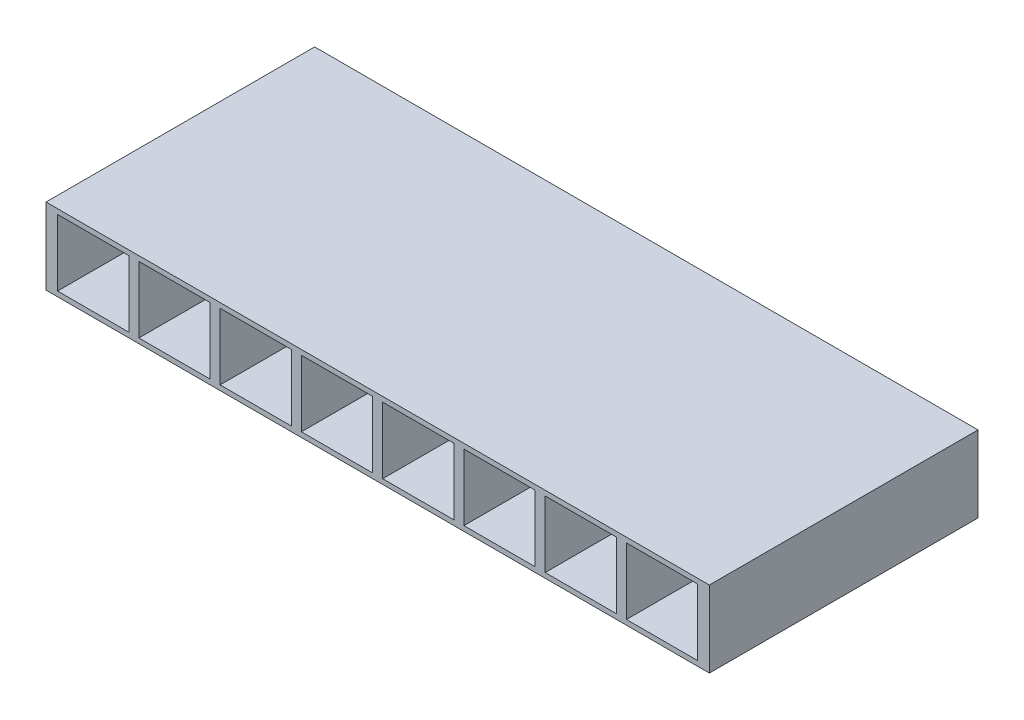
ISO-10303-21;
HEADER;
FILE_DESCRIPTION(('STEP AP214'),'2;1');
FILE_NAME('part.step','',(''),(''),'','','');
FILE_SCHEMA(('AUTOMOTIVE_DESIGN { 1 0 10303 214 1 1 1 1 }'));
ENDSEC;
DATA;
#1=APPLICATION_CONTEXT('core data for automotive mechanical design processes');
#2=APPLICATION_PROTOCOL_DEFINITION('international standard','automotive_design',2000,#1);
#3=PRODUCT_CONTEXT('',#1,'mechanical');
#4=PRODUCT('Part','Part','',(#3));
#5=PRODUCT_RELATED_PRODUCT_CATEGORY('part','',(#4));
#6=PRODUCT_DEFINITION_FORMATION('','',#4);
#7=PRODUCT_DEFINITION_CONTEXT('part definition',#1,'design');
#8=PRODUCT_DEFINITION('design','',#6,#7);
#9=PRODUCT_DEFINITION_SHAPE('','',#8);
#10=(LENGTH_UNIT() NAMED_UNIT(*) SI_UNIT(.MILLI.,.METRE.));
#11=(NAMED_UNIT(*) PLANE_ANGLE_UNIT() SI_UNIT($,.RADIAN.));
#12=(NAMED_UNIT(*) SI_UNIT($,.STERADIAN.) SOLID_ANGLE_UNIT());
#13=UNCERTAINTY_MEASURE_WITH_UNIT(LENGTH_MEASURE(1.E-05),#10,'distance_accuracy_value','');
#14=(GEOMETRIC_REPRESENTATION_CONTEXT(3) GLOBAL_UNCERTAINTY_ASSIGNED_CONTEXT((#13)) GLOBAL_UNIT_ASSIGNED_CONTEXT((#10,
#11,#12)) REPRESENTATION_CONTEXT('',''));
#15=CARTESIAN_POINT('',(0.,0.,0.));
#16=DIRECTION('',(0.,0.,1.));
#17=DIRECTION('',(1.,0.,0.));
#18=AXIS2_PLACEMENT_3D('',#15,#16,#17);
#19=CARTESIAN_POINT('',(0.,0.,8.1));
#20=DIRECTION('',(0.,0.,-1.));
#21=DIRECTION('',(-1.,0.,0.));
#22=AXIS2_PLACEMENT_3D('',#19,#20,#21);
#23=PLANE('',#22);
#24=DIRECTION('',(-1.,0.,0.));
#25=VECTOR('',#24,1.);
#26=CARTESIAN_POINT('',(7.55,1.,8.1));
#27=LINE('',#26,#25);
#28=CARTESIAN_POINT('',(9.7,1.,8.1));
#29=VERTEX_POINT('',#28);
#30=CARTESIAN_POINT('',(7.55,1.,8.1));
#31=VERTEX_POINT('',#30);
#32=EDGE_CURVE('E301',#29,#31,#27,.T.);
#33=ORIENTED_EDGE('',*,*,#32,.F.);
#34=DIRECTION('',(0.,1.,0.));
#35=VECTOR('',#34,1.);
#36=CARTESIAN_POINT('',(9.7,-1.,8.1));
#37=LINE('',#36,#35);
#38=CARTESIAN_POINT('',(9.7,-1.,8.1));
#39=VERTEX_POINT('',#38);
#40=EDGE_CURVE('E309',#39,#29,#37,.T.);
#41=ORIENTED_EDGE('',*,*,#40,.F.);
#42=DIRECTION('',(1.,0.,0.));
#43=VECTOR('',#42,1.);
#44=CARTESIAN_POINT('',(7.55,-1.,8.1));
#45=LINE('',#44,#43);
#46=CARTESIAN_POINT('',(7.55,-1.,8.1));
#47=VERTEX_POINT('',#46);
#48=EDGE_CURVE('E306',#47,#39,#45,.T.);
#49=ORIENTED_EDGE('',*,*,#48,.F.);
#50=DIRECTION('',(0.,-1.,0.));
#51=VECTOR('',#50,1.);
#52=CARTESIAN_POINT('',(7.55,-1.,8.1));
#53=LINE('',#52,#51);
#54=EDGE_CURVE('E303',#31,#47,#53,.T.);
#55=ORIENTED_EDGE('',*,*,#54,.F.);
#56=EDGE_LOOP('',(#33,#41,#49,#55));
#57=FACE_BOUND('',#56,.T.);
#58=DIRECTION('',(-1.,0.,0.));
#59=VECTOR('',#58,1.);
#60=CARTESIAN_POINT('',(2.65,1.,8.1));
#61=LINE('',#60,#59);
#62=CARTESIAN_POINT('',(4.8,1.,8.1));
#63=VERTEX_POINT('',#62);
#64=CARTESIAN_POINT('',(2.65,1.,8.1));
#65=VERTEX_POINT('',#64);
#66=EDGE_CURVE('E363',#63,#65,#61,.T.);
#67=ORIENTED_EDGE('',*,*,#66,.F.);
#68=DIRECTION('',(0.,1.,0.));
#69=VECTOR('',#68,1.);
#70=CARTESIAN_POINT('',(4.8,-1.,8.1));
#71=LINE('',#70,#69);
#72=CARTESIAN_POINT('',(4.8,-1.,8.1));
#73=VERTEX_POINT('',#72);
#74=EDGE_CURVE('E371',#73,#63,#71,.T.);
#75=ORIENTED_EDGE('',*,*,#74,.F.);
#76=DIRECTION('',(1.,0.,0.));
#77=VECTOR('',#76,1.);
#78=CARTESIAN_POINT('',(2.65,-1.,8.1));
#79=LINE('',#78,#77);
#80=CARTESIAN_POINT('',(2.65,-1.,8.1));
#81=VERTEX_POINT('',#80);
#82=EDGE_CURVE('E368',#81,#73,#79,.T.);
#83=ORIENTED_EDGE('',*,*,#82,.F.);
#84=DIRECTION('',(0.,-1.,0.));
#85=VECTOR('',#84,1.);
#86=CARTESIAN_POINT('',(2.65,-1.,8.1));
#87=LINE('',#86,#85);
#88=EDGE_CURVE('E365',#65,#81,#87,.T.);
#89=ORIENTED_EDGE('',*,*,#88,.F.);
#90=EDGE_LOOP('',(#67,#75,#83,#89));
#91=FACE_BOUND('',#90,.T.);
#92=DIRECTION('',(-1.,0.,0.));
#93=VECTOR('',#92,1.);
#94=CARTESIAN_POINT('',(-2.25,1.,8.1));
#95=LINE('',#94,#93);
#96=CARTESIAN_POINT('',(-0.1,1.,8.1));
#97=VERTEX_POINT('',#96);
#98=CARTESIAN_POINT('',(-2.25,1.,8.1));
#99=VERTEX_POINT('',#98);
#100=EDGE_CURVE('E425',#97,#99,#95,.T.);
#101=ORIENTED_EDGE('',*,*,#100,.F.);
#102=DIRECTION('',(0.,1.,0.));
#103=VECTOR('',#102,1.);
#104=CARTESIAN_POINT('',(-0.1,-1.,8.1));
#105=LINE('',#104,#103);
#106=CARTESIAN_POINT('',(-0.1,-1.,8.1));
#107=VERTEX_POINT('',#106);
#108=EDGE_CURVE('E433',#107,#97,#105,.T.);
#109=ORIENTED_EDGE('',*,*,#108,.F.);
#110=DIRECTION('',(1.,0.,0.));
#111=VECTOR('',#110,1.);
#112=CARTESIAN_POINT('',(-2.25,-1.,8.1));
#113=LINE('',#112,#111);
#114=CARTESIAN_POINT('',(-2.25,-1.,8.1));
#115=VERTEX_POINT('',#114);
#116=EDGE_CURVE('E430',#115,#107,#113,.T.);
#117=ORIENTED_EDGE('',*,*,#116,.F.);
#118=DIRECTION('',(0.,-1.,0.));
#119=VECTOR('',#118,1.);
#120=CARTESIAN_POINT('',(-2.25,-1.,8.1));
#121=LINE('',#120,#119);
#122=EDGE_CURVE('E427',#99,#115,#121,.T.);
#123=ORIENTED_EDGE('',*,*,#122,.F.);
#124=EDGE_LOOP('',(#101,#109,#117,#123));
#125=FACE_BOUND('',#124,.T.);
#126=DIRECTION('',(0.,1.,0.));
#127=VECTOR('',#126,1.);
#128=CARTESIAN_POINT('',(-5.,-1.,8.1));
#129=LINE('',#128,#127);
#130=CARTESIAN_POINT('',(-5.,-1.,8.1));
#131=VERTEX_POINT('',#130);
#132=CARTESIAN_POINT('',(-5.,1.,8.1));
#133=VERTEX_POINT('',#132);
#134=EDGE_CURVE('E487',#131,#133,#129,.T.);
#135=ORIENTED_EDGE('',*,*,#134,.F.);
#136=DIRECTION('',(1.,0.,0.));
#137=VECTOR('',#136,1.);
#138=CARTESIAN_POINT('',(-7.15,-1.,8.1));
#139=LINE('',#138,#137);
#140=CARTESIAN_POINT('',(-7.15,-1.,8.1));
#141=VERTEX_POINT('',#140);
#142=EDGE_CURVE('E495',#141,#131,#139,.T.);
#143=ORIENTED_EDGE('',*,*,#142,.F.);
#144=DIRECTION('',(0.,-1.,0.));
#145=VECTOR('',#144,1.);
#146=CARTESIAN_POINT('',(-7.15,-1.,8.1));
#147=LINE('',#146,#145);
#148=CARTESIAN_POINT('',(-7.15,1.,8.1));
#149=VERTEX_POINT('',#148);
#150=EDGE_CURVE('E492',#149,#141,#147,.T.);
#151=ORIENTED_EDGE('',*,*,#150,.F.);
#152=DIRECTION('',(-1.,0.,0.));
#153=VECTOR('',#152,1.);
#154=CARTESIAN_POINT('',(-7.15,1.,8.1));
#155=LINE('',#154,#153);
#156=EDGE_CURVE('E489',#133,#149,#155,.T.);
#157=ORIENTED_EDGE('',*,*,#156,.F.);
#158=EDGE_LOOP('',(#135,#143,#151,#157));
#159=FACE_BOUND('',#158,.T.);
#160=DIRECTION('',(0.,1.,0.));
#161=VECTOR('',#160,1.);
#162=CARTESIAN_POINT('',(12.5,-1.15,8.1));
#163=LINE('',#162,#161);
#164=CARTESIAN_POINT('',(12.5,-1.15,8.1));
#165=VERTEX_POINT('',#164);
#166=CARTESIAN_POINT('',(12.5,1.15,8.1));
#167=VERTEX_POINT('',#166);
#168=EDGE_CURVE('E518',#165,#167,#163,.T.);
#169=ORIENTED_EDGE('',*,*,#168,.T.);
#170=DIRECTION('',(-1.,0.,0.));
#171=VECTOR('',#170,1.);
#172=CARTESIAN_POINT('',(-7.5,1.15,8.1));
#173=LINE('',#172,#171);
#174=CARTESIAN_POINT('',(-7.5,1.15,8.1));
#175=VERTEX_POINT('',#174);
#176=EDGE_CURVE('E521',#167,#175,#173,.T.);
#177=ORIENTED_EDGE('',*,*,#176,.T.);
#178=DIRECTION('',(0.,-1.,0.));
#179=VECTOR('',#178,1.);
#180=CARTESIAN_POINT('',(-7.5,-1.15,8.1));
#181=LINE('',#180,#179);
#182=CARTESIAN_POINT('',(-7.5,-1.15,8.1));
#183=VERTEX_POINT('',#182);
#184=EDGE_CURVE('E524',#175,#183,#181,.T.);
#185=ORIENTED_EDGE('',*,*,#184,.T.);
#186=DIRECTION('',(1.,0.,0.));
#187=VECTOR('',#186,1.);
#188=CARTESIAN_POINT('',(-7.5,-1.15,8.1));
#189=LINE('',#188,#187);
#190=EDGE_CURVE('E526',#183,#165,#189,.T.);
#191=ORIENTED_EDGE('',*,*,#190,.T.);
#192=EDGE_LOOP('',(#169,#177,#185,#191));
#193=FACE_BOUND('',#192,.T.);
#194=DIRECTION('',(-1.,0.,0.));
#195=VECTOR('',#194,1.);
#196=CARTESIAN_POINT('',(-4.7,1.,8.1));
#197=LINE('',#196,#195);
#198=CARTESIAN_POINT('',(-2.55,1.,8.1));
#199=VERTEX_POINT('',#198);
#200=CARTESIAN_POINT('',(-4.7,1.,8.1));
#201=VERTEX_POINT('',#200);
#202=EDGE_CURVE('E456',#199,#201,#197,.T.);
#203=ORIENTED_EDGE('',*,*,#202,.F.);
#204=DIRECTION('',(0.,1.,0.));
#205=VECTOR('',#204,1.);
#206=CARTESIAN_POINT('',(-2.55,-1.,8.1));
#207=LINE('',#206,#205);
#208=CARTESIAN_POINT('',(-2.55,-1.,8.1));
#209=VERTEX_POINT('',#208);
#210=EDGE_CURVE('E464',#209,#199,#207,.T.);
#211=ORIENTED_EDGE('',*,*,#210,.F.);
#212=DIRECTION('',(1.,0.,0.));
#213=VECTOR('',#212,1.);
#214=CARTESIAN_POINT('',(-4.7,-1.,8.1));
#215=LINE('',#214,#213);
#216=CARTESIAN_POINT('',(-4.7,-1.,8.1));
#217=VERTEX_POINT('',#216);
#218=EDGE_CURVE('E461',#217,#209,#215,.T.);
#219=ORIENTED_EDGE('',*,*,#218,.F.);
#220=DIRECTION('',(0.,-1.,0.));
#221=VECTOR('',#220,1.);
#222=CARTESIAN_POINT('',(-4.7,-1.,8.1));
#223=LINE('',#222,#221);
#224=EDGE_CURVE('E458',#201,#217,#223,.T.);
#225=ORIENTED_EDGE('',*,*,#224,.F.);
#226=EDGE_LOOP('',(#203,#211,#219,#225));
#227=FACE_BOUND('',#226,.T.);
#228=DIRECTION('',(-1.,0.,0.));
#229=VECTOR('',#228,1.);
#230=CARTESIAN_POINT('',(0.2,1.,8.1));
#231=LINE('',#230,#229);
#232=CARTESIAN_POINT('',(2.35,1.,8.1));
#233=VERTEX_POINT('',#232);
#234=CARTESIAN_POINT('',(0.2,1.,8.1));
#235=VERTEX_POINT('',#234);
#236=EDGE_CURVE('E394',#233,#235,#231,.T.);
#237=ORIENTED_EDGE('',*,*,#236,.F.);
#238=DIRECTION('',(0.,1.,0.));
#239=VECTOR('',#238,1.);
#240=CARTESIAN_POINT('',(2.35,-1.,8.1));
#241=LINE('',#240,#239);
#242=CARTESIAN_POINT('',(2.35,-1.,8.1));
#243=VERTEX_POINT('',#242);
#244=EDGE_CURVE('E402',#243,#233,#241,.T.);
#245=ORIENTED_EDGE('',*,*,#244,.F.);
#246=DIRECTION('',(1.,0.,0.));
#247=VECTOR('',#246,1.);
#248=CARTESIAN_POINT('',(0.2,-1.,8.1));
#249=LINE('',#248,#247);
#250=CARTESIAN_POINT('',(0.2,-1.,8.1));
#251=VERTEX_POINT('',#250);
#252=EDGE_CURVE('E399',#251,#243,#249,.T.);
#253=ORIENTED_EDGE('',*,*,#252,.F.);
#254=DIRECTION('',(0.,-1.,0.));
#255=VECTOR('',#254,1.);
#256=CARTESIAN_POINT('',(0.2,-1.,8.1));
#257=LINE('',#256,#255);
#258=EDGE_CURVE('E396',#235,#251,#257,.T.);
#259=ORIENTED_EDGE('',*,*,#258,.F.);
#260=EDGE_LOOP('',(#237,#245,#253,#259));
#261=FACE_BOUND('',#260,.T.);
#262=DIRECTION('',(-1.,0.,0.));
#263=VECTOR('',#262,1.);
#264=CARTESIAN_POINT('',(5.1,1.,8.1));
#265=LINE('',#264,#263);
#266=CARTESIAN_POINT('',(7.25,1.,8.1));
#267=VERTEX_POINT('',#266);
#268=CARTESIAN_POINT('',(5.1,1.,8.1));
#269=VERTEX_POINT('',#268);
#270=EDGE_CURVE('E332',#267,#269,#265,.T.);
#271=ORIENTED_EDGE('',*,*,#270,.F.);
#272=DIRECTION('',(0.,1.,0.));
#273=VECTOR('',#272,1.);
#274=CARTESIAN_POINT('',(7.25,-1.,8.1));
#275=LINE('',#274,#273);
#276=CARTESIAN_POINT('',(7.25,-1.,8.1));
#277=VERTEX_POINT('',#276);
#278=EDGE_CURVE('E340',#277,#267,#275,.T.);
#279=ORIENTED_EDGE('',*,*,#278,.F.);
#280=DIRECTION('',(1.,0.,0.));
#281=VECTOR('',#280,1.);
#282=CARTESIAN_POINT('',(5.1,-1.,8.1));
#283=LINE('',#282,#281);
#284=CARTESIAN_POINT('',(5.1,-1.,8.1));
#285=VERTEX_POINT('',#284);
#286=EDGE_CURVE('E337',#285,#277,#283,.T.);
#287=ORIENTED_EDGE('',*,*,#286,.F.);
#288=DIRECTION('',(0.,-1.,0.));
#289=VECTOR('',#288,1.);
#290=CARTESIAN_POINT('',(5.1,-1.,8.1));
#291=LINE('',#290,#289);
#292=EDGE_CURVE('E334',#269,#285,#291,.T.);
#293=ORIENTED_EDGE('',*,*,#292,.F.);
#294=EDGE_LOOP('',(#271,#279,#287,#293));
#295=FACE_BOUND('',#294,.T.);
#296=DIRECTION('',(-1.,0.,0.));
#297=VECTOR('',#296,1.);
#298=CARTESIAN_POINT('',(10.,1.,8.1));
#299=LINE('',#298,#297);
#300=CARTESIAN_POINT('',(12.15,1.,8.1));
#301=VERTEX_POINT('',#300);
#302=CARTESIAN_POINT('',(10.,1.,8.1));
#303=VERTEX_POINT('',#302);
#304=EDGE_CURVE('E265',#301,#303,#299,.T.);
#305=ORIENTED_EDGE('',*,*,#304,.F.);
#306=DIRECTION('',(0.,1.,0.));
#307=VECTOR('',#306,1.);
#308=CARTESIAN_POINT('',(12.15,-1.,8.1));
#309=LINE('',#308,#307);
#310=CARTESIAN_POINT('',(12.15,-1.,8.1));
#311=VERTEX_POINT('',#310);
#312=EDGE_CURVE('E287',#311,#301,#309,.T.);
#313=ORIENTED_EDGE('',*,*,#312,.F.);
#314=DIRECTION('',(1.,0.,0.));
#315=VECTOR('',#314,1.);
#316=CARTESIAN_POINT('',(10.,-1.,8.1));
#317=LINE('',#316,#315);
#318=CARTESIAN_POINT('',(10.,-1.,8.1));
#319=VERTEX_POINT('',#318);
#320=EDGE_CURVE('E285',#319,#311,#317,.T.);
#321=ORIENTED_EDGE('',*,*,#320,.F.);
#322=DIRECTION('',(0.,-1.,0.));
#323=VECTOR('',#322,1.);
#324=CARTESIAN_POINT('',(10.,-1.,8.1));
#325=LINE('',#324,#323);
#326=EDGE_CURVE('E273',#303,#319,#325,.T.);
#327=ORIENTED_EDGE('',*,*,#326,.F.);
#328=EDGE_LOOP('',(#305,#313,#321,#327));
#329=FACE_BOUND('',#328,.T.);
#330=ADVANCED_FACE('F32',(#57,#91,#125,#159,#193,#227,#261,#295,#329),#23,.F.);
#331=CARTESIAN_POINT('',(0.,0.,0.));
#332=DIRECTION('',(0.,0.,-1.));
#333=DIRECTION('',(-1.,0.,0.));
#334=AXIS2_PLACEMENT_3D('',#331,#332,#333);
#335=PLANE('',#334);
#336=DIRECTION('',(0.,1.,0.));
#337=VECTOR('',#336,1.);
#338=CARTESIAN_POINT('',(12.5,-1.15,0.));
#339=LINE('',#338,#337);
#340=CARTESIAN_POINT('',(12.5,-1.15,0.));
#341=VERTEX_POINT('',#340);
#342=CARTESIAN_POINT('',(12.5,1.15,0.));
#343=VERTEX_POINT('',#342);
#344=EDGE_CURVE('E517',#341,#343,#339,.T.);
#345=ORIENTED_EDGE('',*,*,#344,.F.);
#346=DIRECTION('',(1.,0.,0.));
#347=VECTOR('',#346,1.);
#348=CARTESIAN_POINT('',(-7.5,-1.15,0.));
#349=LINE('',#348,#347);
#350=CARTESIAN_POINT('',(-7.5,-1.15,0.));
#351=VERTEX_POINT('',#350);
#352=EDGE_CURVE('E522',#351,#341,#349,.T.);
#353=ORIENTED_EDGE('',*,*,#352,.F.);
#354=DIRECTION('',(0.,-1.,0.));
#355=VECTOR('',#354,1.);
#356=CARTESIAN_POINT('',(-7.5,-1.15,0.));
#357=LINE('',#356,#355);
#358=CARTESIAN_POINT('',(-7.5,1.15,0.));
#359=VERTEX_POINT('',#358);
#360=EDGE_CURVE('E533',#359,#351,#357,.T.);
#361=ORIENTED_EDGE('',*,*,#360,.F.);
#362=DIRECTION('',(-1.,0.,0.));
#363=VECTOR('',#362,1.);
#364=CARTESIAN_POINT('',(-7.5,1.15,0.));
#365=LINE('',#364,#363);
#366=EDGE_CURVE('E531',#343,#359,#365,.T.);
#367=ORIENTED_EDGE('',*,*,#366,.F.);
#368=EDGE_LOOP('',(#345,#353,#361,#367));
#369=FACE_BOUND('',#368,.T.);
#370=DIRECTION('',(1.,0.,0.));
#371=VECTOR('',#370,1.);
#372=CARTESIAN_POINT('',(-7.15,-1.,0.));
#373=LINE('',#372,#371);
#374=CARTESIAN_POINT('',(-7.15,-1.,0.));
#375=VERTEX_POINT('',#374);
#376=CARTESIAN_POINT('',(-5.,-1.,0.));
#377=VERTEX_POINT('',#376);
#378=EDGE_CURVE('E490',#375,#377,#373,.T.);
#379=ORIENTED_EDGE('',*,*,#378,.T.);
#380=DIRECTION('',(0.,1.,0.));
#381=VECTOR('',#380,1.);
#382=CARTESIAN_POINT('',(-5.,-1.,0.));
#383=LINE('',#382,#381);
#384=CARTESIAN_POINT('',(-5.,1.,0.));
#385=VERTEX_POINT('',#384);
#386=EDGE_CURVE('E486',#377,#385,#383,.T.);
#387=ORIENTED_EDGE('',*,*,#386,.T.);
#388=DIRECTION('',(-1.,0.,0.));
#389=VECTOR('',#388,1.);
#390=CARTESIAN_POINT('',(-7.15,1.,0.));
#391=LINE('',#390,#389);
#392=CARTESIAN_POINT('',(-7.15,1.,0.));
#393=VERTEX_POINT('',#392);
#394=EDGE_CURVE('E500',#385,#393,#391,.T.);
#395=ORIENTED_EDGE('',*,*,#394,.T.);
#396=DIRECTION('',(0.,-1.,0.));
#397=VECTOR('',#396,1.);
#398=CARTESIAN_POINT('',(-7.15,-1.,0.));
#399=LINE('',#398,#397);
#400=EDGE_CURVE('E503',#393,#375,#399,.T.);
#401=ORIENTED_EDGE('',*,*,#400,.T.);
#402=EDGE_LOOP('',(#379,#387,#395,#401));
#403=FACE_BOUND('',#402,.T.);
#404=DIRECTION('',(0.,1.,0.));
#405=VECTOR('',#404,1.);
#406=CARTESIAN_POINT('',(-2.55,-1.,0.));
#407=LINE('',#406,#405);
#408=CARTESIAN_POINT('',(-2.55,-1.,0.));
#409=VERTEX_POINT('',#408);
#410=CARTESIAN_POINT('',(-2.55,1.,0.));
#411=VERTEX_POINT('',#410);
#412=EDGE_CURVE('E459',#409,#411,#407,.T.);
#413=ORIENTED_EDGE('',*,*,#412,.T.);
#414=DIRECTION('',(-1.,0.,0.));
#415=VECTOR('',#414,1.);
#416=CARTESIAN_POINT('',(-4.7,1.,0.));
#417=LINE('',#416,#415);
#418=CARTESIAN_POINT('',(-4.7,1.,0.));
#419=VERTEX_POINT('',#418);
#420=EDGE_CURVE('E455',#411,#419,#417,.T.);
#421=ORIENTED_EDGE('',*,*,#420,.T.);
#422=DIRECTION('',(0.,-1.,0.));
#423=VECTOR('',#422,1.);
#424=CARTESIAN_POINT('',(-4.7,-1.,0.));
#425=LINE('',#424,#423);
#426=CARTESIAN_POINT('',(-4.7,-1.,0.));
#427=VERTEX_POINT('',#426);
#428=EDGE_CURVE('E469',#419,#427,#425,.T.);
#429=ORIENTED_EDGE('',*,*,#428,.T.);
#430=DIRECTION('',(1.,0.,0.));
#431=VECTOR('',#430,1.);
#432=CARTESIAN_POINT('',(-4.7,-1.,0.));
#433=LINE('',#432,#431);
#434=EDGE_CURVE('E472',#427,#409,#433,.T.);
#435=ORIENTED_EDGE('',*,*,#434,.T.);
#436=EDGE_LOOP('',(#413,#421,#429,#435));
#437=FACE_BOUND('',#436,.T.);
#438=DIRECTION('',(0.,1.,0.));
#439=VECTOR('',#438,1.);
#440=CARTESIAN_POINT('',(-0.1,-1.,0.));
#441=LINE('',#440,#439);
#442=CARTESIAN_POINT('',(-0.1,-1.,0.));
#443=VERTEX_POINT('',#442);
#444=CARTESIAN_POINT('',(-0.1,1.,0.));
#445=VERTEX_POINT('',#444);
#446=EDGE_CURVE('E428',#443,#445,#441,.T.);
#447=ORIENTED_EDGE('',*,*,#446,.T.);
#448=DIRECTION('',(-1.,0.,0.));
#449=VECTOR('',#448,1.);
#450=CARTESIAN_POINT('',(-2.25,1.,0.));
#451=LINE('',#450,#449);
#452=CARTESIAN_POINT('',(-2.25,1.,0.));
#453=VERTEX_POINT('',#452);
#454=EDGE_CURVE('E424',#445,#453,#451,.T.);
#455=ORIENTED_EDGE('',*,*,#454,.T.);
#456=DIRECTION('',(0.,-1.,0.));
#457=VECTOR('',#456,1.);
#458=CARTESIAN_POINT('',(-2.25,-1.,0.));
#459=LINE('',#458,#457);
#460=CARTESIAN_POINT('',(-2.25,-1.,0.));
#461=VERTEX_POINT('',#460);
#462=EDGE_CURVE('E438',#453,#461,#459,.T.);
#463=ORIENTED_EDGE('',*,*,#462,.T.);
#464=DIRECTION('',(1.,0.,0.));
#465=VECTOR('',#464,1.);
#466=CARTESIAN_POINT('',(-2.25,-1.,0.));
#467=LINE('',#466,#465);
#468=EDGE_CURVE('E441',#461,#443,#467,.T.);
#469=ORIENTED_EDGE('',*,*,#468,.T.);
#470=EDGE_LOOP('',(#447,#455,#463,#469));
#471=FACE_BOUND('',#470,.T.);
#472=DIRECTION('',(0.,1.,0.));
#473=VECTOR('',#472,1.);
#474=CARTESIAN_POINT('',(2.35,-1.,0.));
#475=LINE('',#474,#473);
#476=CARTESIAN_POINT('',(2.35,-1.,0.));
#477=VERTEX_POINT('',#476);
#478=CARTESIAN_POINT('',(2.35,1.,0.));
#479=VERTEX_POINT('',#478);
#480=EDGE_CURVE('E397',#477,#479,#475,.T.);
#481=ORIENTED_EDGE('',*,*,#480,.T.);
#482=DIRECTION('',(-1.,0.,0.));
#483=VECTOR('',#482,1.);
#484=CARTESIAN_POINT('',(0.2,1.,0.));
#485=LINE('',#484,#483);
#486=CARTESIAN_POINT('',(0.2,1.,0.));
#487=VERTEX_POINT('',#486);
#488=EDGE_CURVE('E393',#479,#487,#485,.T.);
#489=ORIENTED_EDGE('',*,*,#488,.T.);
#490=DIRECTION('',(0.,-1.,0.));
#491=VECTOR('',#490,1.);
#492=CARTESIAN_POINT('',(0.2,-1.,0.));
#493=LINE('',#492,#491);
#494=CARTESIAN_POINT('',(0.2,-1.,0.));
#495=VERTEX_POINT('',#494);
#496=EDGE_CURVE('E407',#487,#495,#493,.T.);
#497=ORIENTED_EDGE('',*,*,#496,.T.);
#498=DIRECTION('',(1.,0.,0.));
#499=VECTOR('',#498,1.);
#500=CARTESIAN_POINT('',(0.2,-1.,0.));
#501=LINE('',#500,#499);
#502=EDGE_CURVE('E410',#495,#477,#501,.T.);
#503=ORIENTED_EDGE('',*,*,#502,.T.);
#504=EDGE_LOOP('',(#481,#489,#497,#503));
#505=FACE_BOUND('',#504,.T.);
#506=DIRECTION('',(0.,1.,0.));
#507=VECTOR('',#506,1.);
#508=CARTESIAN_POINT('',(4.8,-1.,0.));
#509=LINE('',#508,#507);
#510=CARTESIAN_POINT('',(4.8,-1.,0.));
#511=VERTEX_POINT('',#510);
#512=CARTESIAN_POINT('',(4.8,1.,0.));
#513=VERTEX_POINT('',#512);
#514=EDGE_CURVE('E366',#511,#513,#509,.T.);
#515=ORIENTED_EDGE('',*,*,#514,.T.);
#516=DIRECTION('',(-1.,0.,0.));
#517=VECTOR('',#516,1.);
#518=CARTESIAN_POINT('',(2.65,1.,0.));
#519=LINE('',#518,#517);
#520=CARTESIAN_POINT('',(2.65,1.,0.));
#521=VERTEX_POINT('',#520);
#522=EDGE_CURVE('E362',#513,#521,#519,.T.);
#523=ORIENTED_EDGE('',*,*,#522,.T.);
#524=DIRECTION('',(0.,-1.,0.));
#525=VECTOR('',#524,1.);
#526=CARTESIAN_POINT('',(2.65,-1.,0.));
#527=LINE('',#526,#525);
#528=CARTESIAN_POINT('',(2.65,-1.,0.));
#529=VERTEX_POINT('',#528);
#530=EDGE_CURVE('E376',#521,#529,#527,.T.);
#531=ORIENTED_EDGE('',*,*,#530,.T.);
#532=DIRECTION('',(1.,0.,0.));
#533=VECTOR('',#532,1.);
#534=CARTESIAN_POINT('',(2.65,-1.,0.));
#535=LINE('',#534,#533);
#536=EDGE_CURVE('E379',#529,#511,#535,.T.);
#537=ORIENTED_EDGE('',*,*,#536,.T.);
#538=EDGE_LOOP('',(#515,#523,#531,#537));
#539=FACE_BOUND('',#538,.T.);
#540=DIRECTION('',(0.,1.,0.));
#541=VECTOR('',#540,1.);
#542=CARTESIAN_POINT('',(7.25,-1.,0.));
#543=LINE('',#542,#541);
#544=CARTESIAN_POINT('',(7.25,-1.,0.));
#545=VERTEX_POINT('',#544);
#546=CARTESIAN_POINT('',(7.25,1.,0.));
#547=VERTEX_POINT('',#546);
#548=EDGE_CURVE('E335',#545,#547,#543,.T.);
#549=ORIENTED_EDGE('',*,*,#548,.T.);
#550=DIRECTION('',(-1.,0.,0.));
#551=VECTOR('',#550,1.);
#552=CARTESIAN_POINT('',(5.1,1.,0.));
#553=LINE('',#552,#551);
#554=CARTESIAN_POINT('',(5.1,1.,0.));
#555=VERTEX_POINT('',#554);
#556=EDGE_CURVE('E331',#547,#555,#553,.T.);
#557=ORIENTED_EDGE('',*,*,#556,.T.);
#558=DIRECTION('',(0.,-1.,0.));
#559=VECTOR('',#558,1.);
#560=CARTESIAN_POINT('',(5.1,-1.,0.));
#561=LINE('',#560,#559);
#562=CARTESIAN_POINT('',(5.1,-1.,0.));
#563=VERTEX_POINT('',#562);
#564=EDGE_CURVE('E345',#555,#563,#561,.T.);
#565=ORIENTED_EDGE('',*,*,#564,.T.);
#566=DIRECTION('',(1.,0.,0.));
#567=VECTOR('',#566,1.);
#568=CARTESIAN_POINT('',(5.1,-1.,0.));
#569=LINE('',#568,#567);
#570=EDGE_CURVE('E348',#563,#545,#569,.T.);
#571=ORIENTED_EDGE('',*,*,#570,.T.);
#572=EDGE_LOOP('',(#549,#557,#565,#571));
#573=FACE_BOUND('',#572,.T.);
#574=DIRECTION('',(0.,1.,0.));
#575=VECTOR('',#574,1.);
#576=CARTESIAN_POINT('',(9.7,-1.,0.));
#577=LINE('',#576,#575);
#578=CARTESIAN_POINT('',(9.7,-1.,0.));
#579=VERTEX_POINT('',#578);
#580=CARTESIAN_POINT('',(9.7,1.,0.));
#581=VERTEX_POINT('',#580);
#582=EDGE_CURVE('E304',#579,#581,#577,.T.);
#583=ORIENTED_EDGE('',*,*,#582,.T.);
#584=DIRECTION('',(-1.,0.,0.));
#585=VECTOR('',#584,1.);
#586=CARTESIAN_POINT('',(7.55,1.,0.));
#587=LINE('',#586,#585);
#588=CARTESIAN_POINT('',(7.55,1.,0.));
#589=VERTEX_POINT('',#588);
#590=EDGE_CURVE('E281',#581,#589,#587,.T.);
#591=ORIENTED_EDGE('',*,*,#590,.T.);
#592=DIRECTION('',(0.,-1.,0.));
#593=VECTOR('',#592,1.);
#594=CARTESIAN_POINT('',(7.55,-1.,0.));
#595=LINE('',#594,#593);
#596=CARTESIAN_POINT('',(7.55,-1.,0.));
#597=VERTEX_POINT('',#596);
#598=EDGE_CURVE('E314',#589,#597,#595,.T.);
#599=ORIENTED_EDGE('',*,*,#598,.T.);
#600=DIRECTION('',(1.,0.,0.));
#601=VECTOR('',#600,1.);
#602=CARTESIAN_POINT('',(7.55,-1.,0.));
#603=LINE('',#602,#601);
#604=EDGE_CURVE('E317',#597,#579,#603,.T.);
#605=ORIENTED_EDGE('',*,*,#604,.T.);
#606=EDGE_LOOP('',(#583,#591,#599,#605));
#607=FACE_BOUND('',#606,.T.);
#608=DIRECTION('',(0.,1.,0.));
#609=VECTOR('',#608,1.);
#610=CARTESIAN_POINT('',(12.15,-1.,0.));
#611=LINE('',#610,#609);
#612=CARTESIAN_POINT('',(12.15,-1.,0.));
#613=VERTEX_POINT('',#612);
#614=CARTESIAN_POINT('',(12.15,1.,0.));
#615=VERTEX_POINT('',#614);
#616=EDGE_CURVE('E274',#613,#615,#611,.T.);
#617=ORIENTED_EDGE('',*,*,#616,.T.);
#618=DIRECTION('',(-1.,0.,0.));
#619=VECTOR('',#618,1.);
#620=CARTESIAN_POINT('',(10.,1.,0.));
#621=LINE('',#620,#619);
#622=CARTESIAN_POINT('',(10.,1.,0.));
#623=VERTEX_POINT('',#622);
#624=EDGE_CURVE('E55',#615,#623,#621,.T.);
#625=ORIENTED_EDGE('',*,*,#624,.T.);
#626=DIRECTION('',(0.,-1.,0.));
#627=VECTOR('',#626,1.);
#628=CARTESIAN_POINT('',(10.,-1.,0.));
#629=LINE('',#628,#627);
#630=CARTESIAN_POINT('',(10.,-1.,0.));
#631=VERTEX_POINT('',#630);
#632=EDGE_CURVE('E280',#623,#631,#629,.T.);
#633=ORIENTED_EDGE('',*,*,#632,.T.);
#634=DIRECTION('',(1.,0.,0.));
#635=VECTOR('',#634,1.);
#636=CARTESIAN_POINT('',(10.,-1.,0.));
#637=LINE('',#636,#635);
#638=EDGE_CURVE('E293',#631,#613,#637,.T.);
#639=ORIENTED_EDGE('',*,*,#638,.T.);
#640=EDGE_LOOP('',(#617,#625,#633,#639));
#641=FACE_BOUND('',#640,.T.);
#642=ADVANCED_FACE('F551',(#369,#403,#437,#471,#505,#539,#573,#607,#641),#335,.T.);
#643=CARTESIAN_POINT('',(12.5,-1.15,8.1));
#644=DIRECTION('',(-1.,0.,0.));
#645=DIRECTION('',(0.,0.,1.));
#646=AXIS2_PLACEMENT_3D('',#643,#644,#645);
#647=PLANE('',#646);
#648=ORIENTED_EDGE('',*,*,#344,.T.);
#649=DIRECTION('',(0.,0.,-1.));
#650=VECTOR('',#649,1.);
#651=CARTESIAN_POINT('',(12.5,1.15,8.1));
#652=LINE('',#651,#650);
#653=EDGE_CURVE('E11',#167,#343,#652,.T.);
#654=ORIENTED_EDGE('',*,*,#653,.F.);
#655=ORIENTED_EDGE('',*,*,#168,.F.);
#656=DIRECTION('',(0.,0.,-1.));
#657=VECTOR('',#656,1.);
#658=CARTESIAN_POINT('',(12.5,-1.15,8.1));
#659=LINE('',#658,#657);
#660=EDGE_CURVE('E528',#165,#341,#659,.T.);
#661=ORIENTED_EDGE('',*,*,#660,.T.);
#662=EDGE_LOOP('',(#648,#654,#655,#661));
#663=FACE_BOUND('',#662,.T.);
#664=ADVANCED_FACE('F34',(#663),#647,.F.);
#665=CARTESIAN_POINT('',(-7.5,1.15,8.1));
#666=DIRECTION('',(0.,-1.,0.));
#667=DIRECTION('',(1.,0.,0.));
#668=AXIS2_PLACEMENT_3D('',#665,#666,#667);
#669=PLANE('',#668);
#670=ORIENTED_EDGE('',*,*,#366,.T.);
#671=DIRECTION('',(0.,0.,-1.));
#672=VECTOR('',#671,1.);
#673=CARTESIAN_POINT('',(-7.5,1.15,8.1));
#674=LINE('',#673,#672);
#675=EDGE_CURVE('E40',#175,#359,#674,.T.);
#676=ORIENTED_EDGE('',*,*,#675,.F.);
#677=ORIENTED_EDGE('',*,*,#176,.F.);
#678=ORIENTED_EDGE('',*,*,#653,.T.);
#679=EDGE_LOOP('',(#670,#676,#677,#678));
#680=FACE_BOUND('',#679,.T.);
#681=ADVANCED_FACE('F562',(#680),#669,.F.);
#682=CARTESIAN_POINT('',(-7.5,-1.15,8.1));
#683=DIRECTION('',(1.,0.,0.));
#684=DIRECTION('',(0.,0.,-1.));
#685=AXIS2_PLACEMENT_3D('',#682,#683,#684);
#686=PLANE('',#685);
#687=ORIENTED_EDGE('',*,*,#360,.T.);
#688=DIRECTION('',(0.,0.,-1.));
#689=VECTOR('',#688,1.);
#690=CARTESIAN_POINT('',(-7.5,-1.15,8.1));
#691=LINE('',#690,#689);
#692=EDGE_CURVE('E538',#183,#351,#691,.T.);
#693=ORIENTED_EDGE('',*,*,#692,.F.);
#694=ORIENTED_EDGE('',*,*,#184,.F.);
#695=ORIENTED_EDGE('',*,*,#675,.T.);
#696=EDGE_LOOP('',(#687,#693,#694,#695));
#697=FACE_BOUND('',#696,.T.);
#698=ADVANCED_FACE('F545',(#697),#686,.F.);
#699=CARTESIAN_POINT('',(-7.5,-1.15,8.1));
#700=DIRECTION('',(0.,1.,0.));
#701=DIRECTION('',(-1.,0.,0.));
#702=AXIS2_PLACEMENT_3D('',#699,#700,#701);
#703=PLANE('',#702);
#704=ORIENTED_EDGE('',*,*,#352,.T.);
#705=ORIENTED_EDGE('',*,*,#660,.F.);
#706=ORIENTED_EDGE('',*,*,#190,.F.);
#707=ORIENTED_EDGE('',*,*,#692,.T.);
#708=EDGE_LOOP('',(#704,#705,#706,#707));
#709=FACE_BOUND('',#708,.T.);
#710=ADVANCED_FACE('F555',(#709),#703,.F.);
#711=CARTESIAN_POINT('',(-5.,-1.,8.1));
#712=DIRECTION('',(-1.,0.,0.));
#713=DIRECTION('',(0.,0.,1.));
#714=AXIS2_PLACEMENT_3D('',#711,#712,#713);
#715=PLANE('',#714);
#716=ORIENTED_EDGE('',*,*,#386,.F.);
#717=DIRECTION('',(0.,0.,-1.));
#718=VECTOR('',#717,1.);
#719=CARTESIAN_POINT('',(-5.,-1.,8.1));
#720=LINE('',#719,#718);
#721=EDGE_CURVE('E497',#131,#377,#720,.T.);
#722=ORIENTED_EDGE('',*,*,#721,.F.);
#723=ORIENTED_EDGE('',*,*,#134,.T.);
#724=DIRECTION('',(0.,0.,-1.));
#725=VECTOR('',#724,1.);
#726=CARTESIAN_POINT('',(-5.,1.,8.1));
#727=LINE('',#726,#725);
#728=EDGE_CURVE('E514',#133,#385,#727,.T.);
#729=ORIENTED_EDGE('',*,*,#728,.T.);
#730=EDGE_LOOP('',(#716,#722,#723,#729));
#731=FACE_BOUND('',#730,.T.);
#732=ADVANCED_FACE('F579',(#731),#715,.T.);
#733=CARTESIAN_POINT('',(-7.15,1.,8.1));
#734=DIRECTION('',(0.,-1.,0.));
#735=DIRECTION('',(0.,0.,-1.));
#736=AXIS2_PLACEMENT_3D('',#733,#734,#735);
#737=PLANE('',#736);
#738=ORIENTED_EDGE('',*,*,#394,.F.);
#739=ORIENTED_EDGE('',*,*,#728,.F.);
#740=ORIENTED_EDGE('',*,*,#156,.T.);
#741=DIRECTION('',(0.,0.,-1.));
#742=VECTOR('',#741,1.);
#743=CARTESIAN_POINT('',(-7.15,1.,8.1));
#744=LINE('',#743,#742);
#745=EDGE_CURVE('E512',#149,#393,#744,.T.);
#746=ORIENTED_EDGE('',*,*,#745,.T.);
#747=EDGE_LOOP('',(#738,#739,#740,#746));
#748=FACE_BOUND('',#747,.T.);
#749=ADVANCED_FACE('F586',(#748),#737,.T.);
#750=CARTESIAN_POINT('',(-7.15,-1.,8.1));
#751=DIRECTION('',(1.,0.,0.));
#752=DIRECTION('',(0.,0.,-1.));
#753=AXIS2_PLACEMENT_3D('',#750,#751,#752);
#754=PLANE('',#753);
#755=ORIENTED_EDGE('',*,*,#400,.F.);
#756=ORIENTED_EDGE('',*,*,#745,.F.);
#757=ORIENTED_EDGE('',*,*,#150,.T.);
#758=DIRECTION('',(0.,0.,-1.));
#759=VECTOR('',#758,1.);
#760=CARTESIAN_POINT('',(-7.15,-1.,8.1));
#761=LINE('',#760,#759);
#762=EDGE_CURVE('E510',#141,#375,#761,.T.);
#763=ORIENTED_EDGE('',*,*,#762,.T.);
#764=EDGE_LOOP('',(#755,#756,#757,#763));
#765=FACE_BOUND('',#764,.T.);
#766=ADVANCED_FACE('F591',(#765),#754,.T.);
#767=CARTESIAN_POINT('',(-7.15,-1.,8.1));
#768=DIRECTION('',(0.,1.,0.));
#769=DIRECTION('',(0.,0.,1.));
#770=AXIS2_PLACEMENT_3D('',#767,#768,#769);
#771=PLANE('',#770);
#772=ORIENTED_EDGE('',*,*,#378,.F.);
#773=ORIENTED_EDGE('',*,*,#762,.F.);
#774=ORIENTED_EDGE('',*,*,#142,.T.);
#775=ORIENTED_EDGE('',*,*,#721,.T.);
#776=EDGE_LOOP('',(#772,#773,#774,#775));
#777=FACE_BOUND('',#776,.T.);
#778=ADVANCED_FACE('F598',(#777),#771,.T.);
#779=CARTESIAN_POINT('',(-4.7,1.,8.1));
#780=DIRECTION('',(0.,-1.,0.));
#781=DIRECTION('',(0.,0.,-1.));
#782=AXIS2_PLACEMENT_3D('',#779,#780,#781);
#783=PLANE('',#782);
#784=ORIENTED_EDGE('',*,*,#420,.F.);
#785=DIRECTION('',(0.,0.,-1.));
#786=VECTOR('',#785,1.);
#787=CARTESIAN_POINT('',(-2.55,1.,8.1));
#788=LINE('',#787,#786);
#789=EDGE_CURVE('E466',#199,#411,#788,.T.);
#790=ORIENTED_EDGE('',*,*,#789,.F.);
#791=ORIENTED_EDGE('',*,*,#202,.T.);
#792=DIRECTION('',(0.,0.,-1.));
#793=VECTOR('',#792,1.);
#794=CARTESIAN_POINT('',(-4.7,1.,8.1));
#795=LINE('',#794,#793);
#796=EDGE_CURVE('E483',#201,#419,#795,.T.);
#797=ORIENTED_EDGE('',*,*,#796,.T.);
#798=EDGE_LOOP('',(#784,#790,#791,#797));
#799=FACE_BOUND('',#798,.T.);
#800=ADVANCED_FACE('F612',(#799),#783,.T.);
#801=CARTESIAN_POINT('',(-4.7,-1.,8.1));
#802=DIRECTION('',(1.,0.,0.));
#803=DIRECTION('',(0.,0.,-1.));
#804=AXIS2_PLACEMENT_3D('',#801,#802,#803);
#805=PLANE('',#804);
#806=ORIENTED_EDGE('',*,*,#428,.F.);
#807=ORIENTED_EDGE('',*,*,#796,.F.);
#808=ORIENTED_EDGE('',*,*,#224,.T.);
#809=DIRECTION('',(0.,0.,-1.));
#810=VECTOR('',#809,1.);
#811=CARTESIAN_POINT('',(-4.7,-1.,8.1));
#812=LINE('',#811,#810);
#813=EDGE_CURVE('E481',#217,#427,#812,.T.);
#814=ORIENTED_EDGE('',*,*,#813,.T.);
#815=EDGE_LOOP('',(#806,#807,#808,#814));
#816=FACE_BOUND('',#815,.T.);
#817=ADVANCED_FACE('F617',(#816),#805,.T.);
#818=CARTESIAN_POINT('',(-4.7,-1.,8.1));
#819=DIRECTION('',(0.,1.,0.));
#820=DIRECTION('',(0.,0.,1.));
#821=AXIS2_PLACEMENT_3D('',#818,#819,#820);
#822=PLANE('',#821);
#823=ORIENTED_EDGE('',*,*,#434,.F.);
#824=ORIENTED_EDGE('',*,*,#813,.F.);
#825=ORIENTED_EDGE('',*,*,#218,.T.);
#826=DIRECTION('',(0.,0.,-1.));
#827=VECTOR('',#826,1.);
#828=CARTESIAN_POINT('',(-2.55,-1.,8.1));
#829=LINE('',#828,#827);
#830=EDGE_CURVE('E479',#209,#409,#829,.T.);
#831=ORIENTED_EDGE('',*,*,#830,.T.);
#832=EDGE_LOOP('',(#823,#824,#825,#831));
#833=FACE_BOUND('',#832,.T.);
#834=ADVANCED_FACE('F621',(#833),#822,.T.);
#835=CARTESIAN_POINT('',(-2.55,-1.,8.1));
#836=DIRECTION('',(-1.,0.,0.));
#837=DIRECTION('',(0.,0.,1.));
#838=AXIS2_PLACEMENT_3D('',#835,#836,#837);
#839=PLANE('',#838);
#840=ORIENTED_EDGE('',*,*,#412,.F.);
#841=ORIENTED_EDGE('',*,*,#830,.F.);
#842=ORIENTED_EDGE('',*,*,#210,.T.);
#843=ORIENTED_EDGE('',*,*,#789,.T.);
#844=EDGE_LOOP('',(#840,#841,#842,#843));
#845=FACE_BOUND('',#844,.T.);
#846=ADVANCED_FACE('F625',(#845),#839,.T.);
#847=CARTESIAN_POINT('',(-2.25,1.,8.1));
#848=DIRECTION('',(0.,-1.,0.));
#849=DIRECTION('',(0.,0.,-1.));
#850=AXIS2_PLACEMENT_3D('',#847,#848,#849);
#851=PLANE('',#850);
#852=ORIENTED_EDGE('',*,*,#454,.F.);
#853=DIRECTION('',(0.,0.,-1.));
#854=VECTOR('',#853,1.);
#855=CARTESIAN_POINT('',(-0.1,1.,8.1));
#856=LINE('',#855,#854);
#857=EDGE_CURVE('E435',#97,#445,#856,.T.);
#858=ORIENTED_EDGE('',*,*,#857,.F.);
#859=ORIENTED_EDGE('',*,*,#100,.T.);
#860=DIRECTION('',(0.,0.,-1.));
#861=VECTOR('',#860,1.);
#862=CARTESIAN_POINT('',(-2.25,1.,8.1));
#863=LINE('',#862,#861);
#864=EDGE_CURVE('E452',#99,#453,#863,.T.);
#865=ORIENTED_EDGE('',*,*,#864,.T.);
#866=EDGE_LOOP('',(#852,#858,#859,#865));
#867=FACE_BOUND('',#866,.T.);
#868=ADVANCED_FACE('F629',(#867),#851,.T.);
#869=CARTESIAN_POINT('',(-2.25,-1.,8.1));
#870=DIRECTION('',(1.,0.,0.));
#871=DIRECTION('',(0.,0.,-1.));
#872=AXIS2_PLACEMENT_3D('',#869,#870,#871);
#873=PLANE('',#872);
#874=ORIENTED_EDGE('',*,*,#462,.F.);
#875=ORIENTED_EDGE('',*,*,#864,.F.);
#876=ORIENTED_EDGE('',*,*,#122,.T.);
#877=DIRECTION('',(0.,0.,-1.));
#878=VECTOR('',#877,1.);
#879=CARTESIAN_POINT('',(-2.25,-1.,8.1));
#880=LINE('',#879,#878);
#881=EDGE_CURVE('E450',#115,#461,#880,.T.);
#882=ORIENTED_EDGE('',*,*,#881,.T.);
#883=EDGE_LOOP('',(#874,#875,#876,#882));
#884=FACE_BOUND('',#883,.T.);
#885=ADVANCED_FACE('F633',(#884),#873,.T.);
#886=CARTESIAN_POINT('',(-2.25,-1.,8.1));
#887=DIRECTION('',(0.,1.,0.));
#888=DIRECTION('',(0.,0.,1.));
#889=AXIS2_PLACEMENT_3D('',#886,#887,#888);
#890=PLANE('',#889);
#891=ORIENTED_EDGE('',*,*,#468,.F.);
#892=ORIENTED_EDGE('',*,*,#881,.F.);
#893=ORIENTED_EDGE('',*,*,#116,.T.);
#894=DIRECTION('',(0.,0.,-1.));
#895=VECTOR('',#894,1.);
#896=CARTESIAN_POINT('',(-0.1,-1.,8.1));
#897=LINE('',#896,#895);
#898=EDGE_CURVE('E448',#107,#443,#897,.T.);
#899=ORIENTED_EDGE('',*,*,#898,.T.);
#900=EDGE_LOOP('',(#891,#892,#893,#899));
#901=FACE_BOUND('',#900,.T.);
#902=ADVANCED_FACE('F637',(#901),#890,.T.);
#903=CARTESIAN_POINT('',(-0.1,-1.,8.1));
#904=DIRECTION('',(-1.,0.,0.));
#905=DIRECTION('',(0.,0.,1.));
#906=AXIS2_PLACEMENT_3D('',#903,#904,#905);
#907=PLANE('',#906);
#908=ORIENTED_EDGE('',*,*,#446,.F.);
#909=ORIENTED_EDGE('',*,*,#898,.F.);
#910=ORIENTED_EDGE('',*,*,#108,.T.);
#911=ORIENTED_EDGE('',*,*,#857,.T.);
#912=EDGE_LOOP('',(#908,#909,#910,#911));
#913=FACE_BOUND('',#912,.T.);
#914=ADVANCED_FACE('F641',(#913),#907,.T.);
#915=CARTESIAN_POINT('',(0.2,1.,8.1));
#916=DIRECTION('',(0.,-1.,0.));
#917=DIRECTION('',(0.,0.,-1.));
#918=AXIS2_PLACEMENT_3D('',#915,#916,#917);
#919=PLANE('',#918);
#920=ORIENTED_EDGE('',*,*,#488,.F.);
#921=DIRECTION('',(0.,0.,-1.));
#922=VECTOR('',#921,1.);
#923=CARTESIAN_POINT('',(2.35,1.,8.1));
#924=LINE('',#923,#922);
#925=EDGE_CURVE('E404',#233,#479,#924,.T.);
#926=ORIENTED_EDGE('',*,*,#925,.F.);
#927=ORIENTED_EDGE('',*,*,#236,.T.);
#928=DIRECTION('',(0.,0.,-1.));
#929=VECTOR('',#928,1.);
#930=CARTESIAN_POINT('',(0.2,1.,8.1));
#931=LINE('',#930,#929);
#932=EDGE_CURVE('E421',#235,#487,#931,.T.);
#933=ORIENTED_EDGE('',*,*,#932,.T.);
#934=EDGE_LOOP('',(#920,#926,#927,#933));
#935=FACE_BOUND('',#934,.T.);
#936=ADVANCED_FACE('F645',(#935),#919,.T.);
#937=CARTESIAN_POINT('',(0.2,-1.,8.1));
#938=DIRECTION('',(1.,0.,0.));
#939=DIRECTION('',(0.,0.,-1.));
#940=AXIS2_PLACEMENT_3D('',#937,#938,#939);
#941=PLANE('',#940);
#942=ORIENTED_EDGE('',*,*,#496,.F.);
#943=ORIENTED_EDGE('',*,*,#932,.F.);
#944=ORIENTED_EDGE('',*,*,#258,.T.);
#945=DIRECTION('',(0.,0.,-1.));
#946=VECTOR('',#945,1.);
#947=CARTESIAN_POINT('',(0.2,-1.,8.1));
#948=LINE('',#947,#946);
#949=EDGE_CURVE('E419',#251,#495,#948,.T.);
#950=ORIENTED_EDGE('',*,*,#949,.T.);
#951=EDGE_LOOP('',(#942,#943,#944,#950));
#952=FACE_BOUND('',#951,.T.);
#953=ADVANCED_FACE('F649',(#952),#941,.T.);
#954=CARTESIAN_POINT('',(0.2,-1.,8.1));
#955=DIRECTION('',(0.,1.,0.));
#956=DIRECTION('',(0.,0.,1.));
#957=AXIS2_PLACEMENT_3D('',#954,#955,#956);
#958=PLANE('',#957);
#959=ORIENTED_EDGE('',*,*,#502,.F.);
#960=ORIENTED_EDGE('',*,*,#949,.F.);
#961=ORIENTED_EDGE('',*,*,#252,.T.);
#962=DIRECTION('',(0.,0.,-1.));
#963=VECTOR('',#962,1.);
#964=CARTESIAN_POINT('',(2.35,-1.,8.1));
#965=LINE('',#964,#963);
#966=EDGE_CURVE('E417',#243,#477,#965,.T.);
#967=ORIENTED_EDGE('',*,*,#966,.T.);
#968=EDGE_LOOP('',(#959,#960,#961,#967));
#969=FACE_BOUND('',#968,.T.);
#970=ADVANCED_FACE('F653',(#969),#958,.T.);
#971=CARTESIAN_POINT('',(2.35,-1.,8.1));
#972=DIRECTION('',(-1.,0.,0.));
#973=DIRECTION('',(0.,0.,1.));
#974=AXIS2_PLACEMENT_3D('',#971,#972,#973);
#975=PLANE('',#974);
#976=ORIENTED_EDGE('',*,*,#480,.F.);
#977=ORIENTED_EDGE('',*,*,#966,.F.);
#978=ORIENTED_EDGE('',*,*,#244,.T.);
#979=ORIENTED_EDGE('',*,*,#925,.T.);
#980=EDGE_LOOP('',(#976,#977,#978,#979));
#981=FACE_BOUND('',#980,.T.);
#982=ADVANCED_FACE('F657',(#981),#975,.T.);
#983=CARTESIAN_POINT('',(2.65,1.,8.1));
#984=DIRECTION('',(0.,-1.,0.));
#985=DIRECTION('',(0.,0.,-1.));
#986=AXIS2_PLACEMENT_3D('',#983,#984,#985);
#987=PLANE('',#986);
#988=ORIENTED_EDGE('',*,*,#522,.F.);
#989=DIRECTION('',(0.,0.,-1.));
#990=VECTOR('',#989,1.);
#991=CARTESIAN_POINT('',(4.8,1.,8.1));
#992=LINE('',#991,#990);
#993=EDGE_CURVE('E373',#63,#513,#992,.T.);
#994=ORIENTED_EDGE('',*,*,#993,.F.);
#995=ORIENTED_EDGE('',*,*,#66,.T.);
#996=DIRECTION('',(0.,0.,-1.));
#997=VECTOR('',#996,1.);
#998=CARTESIAN_POINT('',(2.65,1.,8.1));
#999=LINE('',#998,#997);
#1000=EDGE_CURVE('E390',#65,#521,#999,.T.);
#1001=ORIENTED_EDGE('',*,*,#1000,.T.);
#1002=EDGE_LOOP('',(#988,#994,#995,#1001));
#1003=FACE_BOUND('',#1002,.T.);
#1004=ADVANCED_FACE('F661',(#1003),#987,.T.);
#1005=CARTESIAN_POINT('',(2.65,-1.,8.1));
#1006=DIRECTION('',(1.,0.,0.));
#1007=DIRECTION('',(0.,0.,-1.));
#1008=AXIS2_PLACEMENT_3D('',#1005,#1006,#1007);
#1009=PLANE('',#1008);
#1010=ORIENTED_EDGE('',*,*,#530,.F.);
#1011=ORIENTED_EDGE('',*,*,#1000,.F.);
#1012=ORIENTED_EDGE('',*,*,#88,.T.);
#1013=DIRECTION('',(0.,0.,-1.));
#1014=VECTOR('',#1013,1.);
#1015=CARTESIAN_POINT('',(2.65,-1.,8.1));
#1016=LINE('',#1015,#1014);
#1017=EDGE_CURVE('E388',#81,#529,#1016,.T.);
#1018=ORIENTED_EDGE('',*,*,#1017,.T.);
#1019=EDGE_LOOP('',(#1010,#1011,#1012,#1018));
#1020=FACE_BOUND('',#1019,.T.);
#1021=ADVANCED_FACE('F665',(#1020),#1009,.T.);
#1022=CARTESIAN_POINT('',(2.65,-1.,8.1));
#1023=DIRECTION('',(0.,1.,0.));
#1024=DIRECTION('',(0.,0.,1.));
#1025=AXIS2_PLACEMENT_3D('',#1022,#1023,#1024);
#1026=PLANE('',#1025);
#1027=ORIENTED_EDGE('',*,*,#536,.F.);
#1028=ORIENTED_EDGE('',*,*,#1017,.F.);
#1029=ORIENTED_EDGE('',*,*,#82,.T.);
#1030=DIRECTION('',(0.,0.,-1.));
#1031=VECTOR('',#1030,1.);
#1032=CARTESIAN_POINT('',(4.8,-1.,8.1));
#1033=LINE('',#1032,#1031);
#1034=EDGE_CURVE('E386',#73,#511,#1033,.T.);
#1035=ORIENTED_EDGE('',*,*,#1034,.T.);
#1036=EDGE_LOOP('',(#1027,#1028,#1029,#1035));
#1037=FACE_BOUND('',#1036,.T.);
#1038=ADVANCED_FACE('F669',(#1037),#1026,.T.);
#1039=CARTESIAN_POINT('',(4.8,-1.,8.1));
#1040=DIRECTION('',(-1.,0.,0.));
#1041=DIRECTION('',(0.,0.,1.));
#1042=AXIS2_PLACEMENT_3D('',#1039,#1040,#1041);
#1043=PLANE('',#1042);
#1044=ORIENTED_EDGE('',*,*,#514,.F.);
#1045=ORIENTED_EDGE('',*,*,#1034,.F.);
#1046=ORIENTED_EDGE('',*,*,#74,.T.);
#1047=ORIENTED_EDGE('',*,*,#993,.T.);
#1048=EDGE_LOOP('',(#1044,#1045,#1046,#1047));
#1049=FACE_BOUND('',#1048,.T.);
#1050=ADVANCED_FACE('F673',(#1049),#1043,.T.);
#1051=CARTESIAN_POINT('',(5.1,1.,8.1));
#1052=DIRECTION('',(0.,-1.,0.));
#1053=DIRECTION('',(0.,0.,-1.));
#1054=AXIS2_PLACEMENT_3D('',#1051,#1052,#1053);
#1055=PLANE('',#1054);
#1056=ORIENTED_EDGE('',*,*,#556,.F.);
#1057=DIRECTION('',(0.,0.,-1.));
#1058=VECTOR('',#1057,1.);
#1059=CARTESIAN_POINT('',(7.25,1.,8.1));
#1060=LINE('',#1059,#1058);
#1061=EDGE_CURVE('E342',#267,#547,#1060,.T.);
#1062=ORIENTED_EDGE('',*,*,#1061,.F.);
#1063=ORIENTED_EDGE('',*,*,#270,.T.);
#1064=DIRECTION('',(0.,0.,-1.));
#1065=VECTOR('',#1064,1.);
#1066=CARTESIAN_POINT('',(5.1,1.,8.1));
#1067=LINE('',#1066,#1065);
#1068=EDGE_CURVE('E359',#269,#555,#1067,.T.);
#1069=ORIENTED_EDGE('',*,*,#1068,.T.);
#1070=EDGE_LOOP('',(#1056,#1062,#1063,#1069));
#1071=FACE_BOUND('',#1070,.T.);
#1072=ADVANCED_FACE('F677',(#1071),#1055,.T.);
#1073=CARTESIAN_POINT('',(5.1,-1.,8.1));
#1074=DIRECTION('',(1.,0.,0.));
#1075=DIRECTION('',(0.,0.,-1.));
#1076=AXIS2_PLACEMENT_3D('',#1073,#1074,#1075);
#1077=PLANE('',#1076);
#1078=ORIENTED_EDGE('',*,*,#564,.F.);
#1079=ORIENTED_EDGE('',*,*,#1068,.F.);
#1080=ORIENTED_EDGE('',*,*,#292,.T.);
#1081=DIRECTION('',(0.,0.,-1.));
#1082=VECTOR('',#1081,1.);
#1083=CARTESIAN_POINT('',(5.1,-1.,8.1));
#1084=LINE('',#1083,#1082);
#1085=EDGE_CURVE('E357',#285,#563,#1084,.T.);
#1086=ORIENTED_EDGE('',*,*,#1085,.T.);
#1087=EDGE_LOOP('',(#1078,#1079,#1080,#1086));
#1088=FACE_BOUND('',#1087,.T.);
#1089=ADVANCED_FACE('F681',(#1088),#1077,.T.);
#1090=CARTESIAN_POINT('',(5.1,-1.,8.1));
#1091=DIRECTION('',(0.,1.,0.));
#1092=DIRECTION('',(0.,0.,1.));
#1093=AXIS2_PLACEMENT_3D('',#1090,#1091,#1092);
#1094=PLANE('',#1093);
#1095=ORIENTED_EDGE('',*,*,#570,.F.);
#1096=ORIENTED_EDGE('',*,*,#1085,.F.);
#1097=ORIENTED_EDGE('',*,*,#286,.T.);
#1098=DIRECTION('',(0.,0.,-1.));
#1099=VECTOR('',#1098,1.);
#1100=CARTESIAN_POINT('',(7.25,-1.,8.1));
#1101=LINE('',#1100,#1099);
#1102=EDGE_CURVE('E355',#277,#545,#1101,.T.);
#1103=ORIENTED_EDGE('',*,*,#1102,.T.);
#1104=EDGE_LOOP('',(#1095,#1096,#1097,#1103));
#1105=FACE_BOUND('',#1104,.T.);
#1106=ADVANCED_FACE('F685',(#1105),#1094,.T.);
#1107=CARTESIAN_POINT('',(7.25,-1.,8.1));
#1108=DIRECTION('',(-1.,0.,0.));
#1109=DIRECTION('',(0.,0.,1.));
#1110=AXIS2_PLACEMENT_3D('',#1107,#1108,#1109);
#1111=PLANE('',#1110);
#1112=ORIENTED_EDGE('',*,*,#548,.F.);
#1113=ORIENTED_EDGE('',*,*,#1102,.F.);
#1114=ORIENTED_EDGE('',*,*,#278,.T.);
#1115=ORIENTED_EDGE('',*,*,#1061,.T.);
#1116=EDGE_LOOP('',(#1112,#1113,#1114,#1115));
#1117=FACE_BOUND('',#1116,.T.);
#1118=ADVANCED_FACE('F689',(#1117),#1111,.T.);
#1119=CARTESIAN_POINT('',(7.55,1.,8.1));
#1120=DIRECTION('',(0.,-1.,0.));
#1121=DIRECTION('',(0.,0.,-1.));
#1122=AXIS2_PLACEMENT_3D('',#1119,#1120,#1121);
#1123=PLANE('',#1122);
#1124=ORIENTED_EDGE('',*,*,#590,.F.);
#1125=DIRECTION('',(0.,0.,-1.));
#1126=VECTOR('',#1125,1.);
#1127=CARTESIAN_POINT('',(9.7,1.,8.1));
#1128=LINE('',#1127,#1126);
#1129=EDGE_CURVE('E311',#29,#581,#1128,.T.);
#1130=ORIENTED_EDGE('',*,*,#1129,.F.);
#1131=ORIENTED_EDGE('',*,*,#32,.T.);
#1132=DIRECTION('',(0.,0.,-1.));
#1133=VECTOR('',#1132,1.);
#1134=CARTESIAN_POINT('',(7.55,1.,8.1));
#1135=LINE('',#1134,#1133);
#1136=EDGE_CURVE('E328',#31,#589,#1135,.T.);
#1137=ORIENTED_EDGE('',*,*,#1136,.T.);
#1138=EDGE_LOOP('',(#1124,#1130,#1131,#1137));
#1139=FACE_BOUND('',#1138,.T.);
#1140=ADVANCED_FACE('F693',(#1139),#1123,.T.);
#1141=CARTESIAN_POINT('',(7.55,-1.,8.1));
#1142=DIRECTION('',(1.,0.,0.));
#1143=DIRECTION('',(0.,0.,-1.));
#1144=AXIS2_PLACEMENT_3D('',#1141,#1142,#1143);
#1145=PLANE('',#1144);
#1146=ORIENTED_EDGE('',*,*,#598,.F.);
#1147=ORIENTED_EDGE('',*,*,#1136,.F.);
#1148=ORIENTED_EDGE('',*,*,#54,.T.);
#1149=DIRECTION('',(0.,0.,-1.));
#1150=VECTOR('',#1149,1.);
#1151=CARTESIAN_POINT('',(7.55,-1.,8.1));
#1152=LINE('',#1151,#1150);
#1153=EDGE_CURVE('E326',#47,#597,#1152,.T.);
#1154=ORIENTED_EDGE('',*,*,#1153,.T.);
#1155=EDGE_LOOP('',(#1146,#1147,#1148,#1154));
#1156=FACE_BOUND('',#1155,.T.);
#1157=ADVANCED_FACE('F697',(#1156),#1145,.T.);
#1158=CARTESIAN_POINT('',(7.55,-1.,8.1));
#1159=DIRECTION('',(0.,1.,0.));
#1160=DIRECTION('',(0.,0.,1.));
#1161=AXIS2_PLACEMENT_3D('',#1158,#1159,#1160);
#1162=PLANE('',#1161);
#1163=ORIENTED_EDGE('',*,*,#604,.F.);
#1164=ORIENTED_EDGE('',*,*,#1153,.F.);
#1165=ORIENTED_EDGE('',*,*,#48,.T.);
#1166=DIRECTION('',(0.,0.,-1.));
#1167=VECTOR('',#1166,1.);
#1168=CARTESIAN_POINT('',(9.7,-1.,8.1));
#1169=LINE('',#1168,#1167);
#1170=EDGE_CURVE('E324',#39,#579,#1169,.T.);
#1171=ORIENTED_EDGE('',*,*,#1170,.T.);
#1172=EDGE_LOOP('',(#1163,#1164,#1165,#1171));
#1173=FACE_BOUND('',#1172,.T.);
#1174=ADVANCED_FACE('F701',(#1173),#1162,.T.);
#1175=CARTESIAN_POINT('',(9.7,-1.,8.1));
#1176=DIRECTION('',(-1.,0.,0.));
#1177=DIRECTION('',(0.,0.,1.));
#1178=AXIS2_PLACEMENT_3D('',#1175,#1176,#1177);
#1179=PLANE('',#1178);
#1180=ORIENTED_EDGE('',*,*,#582,.F.);
#1181=ORIENTED_EDGE('',*,*,#1170,.F.);
#1182=ORIENTED_EDGE('',*,*,#40,.T.);
#1183=ORIENTED_EDGE('',*,*,#1129,.T.);
#1184=EDGE_LOOP('',(#1180,#1181,#1182,#1183));
#1185=FACE_BOUND('',#1184,.T.);
#1186=ADVANCED_FACE('F705',(#1185),#1179,.T.);
#1187=CARTESIAN_POINT('',(10.,1.,8.1));
#1188=DIRECTION('',(0.,-1.,0.));
#1189=DIRECTION('',(0.,0.,-1.));
#1190=AXIS2_PLACEMENT_3D('',#1187,#1188,#1189);
#1191=PLANE('',#1190);
#1192=ORIENTED_EDGE('',*,*,#624,.F.);
#1193=DIRECTION('',(0.,0.,-1.));
#1194=VECTOR('',#1193,1.);
#1195=CARTESIAN_POINT('',(12.15,1.,8.1));
#1196=LINE('',#1195,#1194);
#1197=EDGE_CURVE('E269',#301,#615,#1196,.T.);
#1198=ORIENTED_EDGE('',*,*,#1197,.F.);
#1199=ORIENTED_EDGE('',*,*,#304,.T.);
#1200=DIRECTION('',(0.,0.,-1.));
#1201=VECTOR('',#1200,1.);
#1202=CARTESIAN_POINT('',(10.,1.,8.1));
#1203=LINE('',#1202,#1201);
#1204=EDGE_CURVE('E268',#303,#623,#1203,.T.);
#1205=ORIENTED_EDGE('',*,*,#1204,.T.);
#1206=EDGE_LOOP('',(#1192,#1198,#1199,#1205));
#1207=FACE_BOUND('',#1206,.T.);
#1208=ADVANCED_FACE('F267',(#1207),#1191,.T.);
#1209=CARTESIAN_POINT('',(10.,-1.,8.1));
#1210=DIRECTION('',(1.,0.,0.));
#1211=DIRECTION('',(0.,0.,-1.));
#1212=AXIS2_PLACEMENT_3D('',#1209,#1210,#1211);
#1213=PLANE('',#1212);
#1214=ORIENTED_EDGE('',*,*,#632,.F.);
#1215=ORIENTED_EDGE('',*,*,#1204,.F.);
#1216=ORIENTED_EDGE('',*,*,#326,.T.);
#1217=DIRECTION('',(0.,0.,-1.));
#1218=VECTOR('',#1217,1.);
#1219=CARTESIAN_POINT('',(10.,-1.,8.1));
#1220=LINE('',#1219,#1218);
#1221=EDGE_CURVE('E282',#319,#631,#1220,.T.);
#1222=ORIENTED_EDGE('',*,*,#1221,.T.);
#1223=EDGE_LOOP('',(#1214,#1215,#1216,#1222));
#1224=FACE_BOUND('',#1223,.T.);
#1225=ADVANCED_FACE('F277',(#1224),#1213,.T.);
#1226=CARTESIAN_POINT('',(10.,-1.,8.1));
#1227=DIRECTION('',(0.,1.,0.));
#1228=DIRECTION('',(0.,0.,1.));
#1229=AXIS2_PLACEMENT_3D('',#1226,#1227,#1228);
#1230=PLANE('',#1229);
#1231=ORIENTED_EDGE('',*,*,#638,.F.);
#1232=ORIENTED_EDGE('',*,*,#1221,.F.);
#1233=ORIENTED_EDGE('',*,*,#320,.T.);
#1234=DIRECTION('',(0.,0.,-1.));
#1235=VECTOR('',#1234,1.);
#1236=CARTESIAN_POINT('',(12.15,-1.,8.1));
#1237=LINE('',#1236,#1235);
#1238=EDGE_CURVE('E47',#311,#613,#1237,.T.);
#1239=ORIENTED_EDGE('',*,*,#1238,.T.);
#1240=EDGE_LOOP('',(#1231,#1232,#1233,#1239));
#1241=FACE_BOUND('',#1240,.T.);
#1242=ADVANCED_FACE('F714',(#1241),#1230,.T.);
#1243=CARTESIAN_POINT('',(12.15,-1.,8.1));
#1244=DIRECTION('',(-1.,0.,0.));
#1245=DIRECTION('',(0.,0.,1.));
#1246=AXIS2_PLACEMENT_3D('',#1243,#1244,#1245);
#1247=PLANE('',#1246);
#1248=ORIENTED_EDGE('',*,*,#616,.F.);
#1249=ORIENTED_EDGE('',*,*,#1238,.F.);
#1250=ORIENTED_EDGE('',*,*,#312,.T.);
#1251=ORIENTED_EDGE('',*,*,#1197,.T.);
#1252=EDGE_LOOP('',(#1248,#1249,#1250,#1251));
#1253=FACE_BOUND('',#1252,.T.);
#1254=ADVANCED_FACE('F717',(#1253),#1247,.T.);
#1255=CLOSED_SHELL('',(#330,#642,#664,#681,#698,#710,#732,#749,#766,#778,#800,#817,#834,#846,
#868,#885,#902,#914,#936,#953,#970,#982,#1004,#1021,#1038,#1050,#1072,#1089,#1106,#1118,#1140,
#1157,#1174,#1186,#1208,#1225,#1242,#1254));
#1256=MANIFOLD_SOLID_BREP('B2',#1255);
#1257=ADVANCED_BREP_SHAPE_REPRESENTATION('',(#18,#1256),#14);
#1258=SHAPE_DEFINITION_REPRESENTATION(#9,#1257);
ENDSEC;
END-ISO-10303-21;
